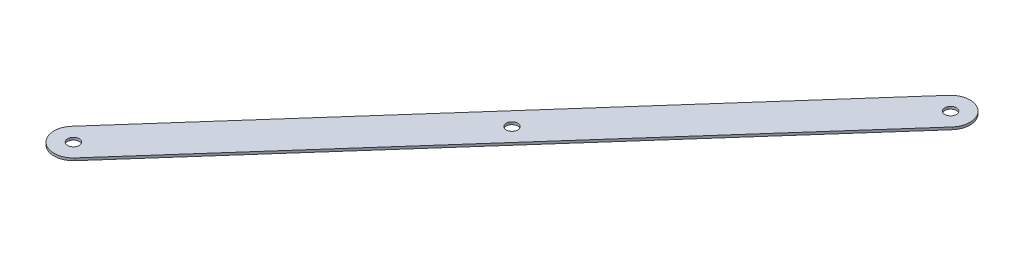
ISO-10303-21;
HEADER;
FILE_DESCRIPTION(('STEP AP214'),'2;1');
FILE_NAME('part.step','',(''),(''),'','','');
FILE_SCHEMA(('AUTOMOTIVE_DESIGN { 1 0 10303 214 1 1 1 1 }'));
ENDSEC;
DATA;
#1=APPLICATION_CONTEXT('core data for automotive mechanical design processes');
#2=APPLICATION_PROTOCOL_DEFINITION('international standard','automotive_design',2000,#1);
#3=PRODUCT_CONTEXT('',#1,'mechanical');
#4=PRODUCT('Part','Part','',(#3));
#5=PRODUCT_RELATED_PRODUCT_CATEGORY('part','',(#4));
#6=PRODUCT_DEFINITION_FORMATION('','',#4);
#7=PRODUCT_DEFINITION_CONTEXT('part definition',#1,'design');
#8=PRODUCT_DEFINITION('design','',#6,#7);
#9=PRODUCT_DEFINITION_SHAPE('','',#8);
#10=(LENGTH_UNIT() NAMED_UNIT(*) SI_UNIT(.MILLI.,.METRE.));
#11=(NAMED_UNIT(*) PLANE_ANGLE_UNIT() SI_UNIT($,.RADIAN.));
#12=(NAMED_UNIT(*) SI_UNIT($,.STERADIAN.) SOLID_ANGLE_UNIT());
#13=UNCERTAINTY_MEASURE_WITH_UNIT(LENGTH_MEASURE(1.E-05),#10,'distance_accuracy_value','');
#14=(GEOMETRIC_REPRESENTATION_CONTEXT(3) GLOBAL_UNCERTAINTY_ASSIGNED_CONTEXT((#13)) GLOBAL_UNIT_ASSIGNED_CONTEXT((#10,
#11,#12)) REPRESENTATION_CONTEXT('',''));
#15=CARTESIAN_POINT('',(0.,0.,0.));
#16=DIRECTION('',(0.,0.,1.));
#17=DIRECTION('',(1.,0.,0.));
#18=AXIS2_PLACEMENT_3D('',#15,#16,#17);
#19=CARTESIAN_POINT('',(0.,1.5875,0.));
#20=DIRECTION('',(0.,1.,0.));
#21=DIRECTION('',(0.,0.,1.));
#22=AXIS2_PLACEMENT_3D('',#19,#20,#21);
#23=PLANE('',#22);
#24=CARTESIAN_POINT('',(269.295638516068,1.5875,-304.369543608133));
#25=DIRECTION('',(0.,1.,0.));
#26=DIRECTION('',(0.,0.,1.));
#27=AXIS2_PLACEMENT_3D('',#24,#25,#26);
#28=CIRCLE('',#27,3.80999999999998);
#29=CARTESIAN_POINT('',(269.295638516068,1.5875,-300.559543608133));
#30=VERTEX_POINT('',#29);
#31=EDGE_CURVE('E115',#30,#30,#28,.T.);
#32=ORIENTED_EDGE('',*,*,#31,.F.);
#33=EDGE_LOOP('',(#32));
#34=FACE_BOUND('',#33,.T.);
#35=CARTESIAN_POINT('',(0.,1.5875,0.));
#36=DIRECTION('',(0.,1.,0.));
#37=DIRECTION('',(0.,0.,1.));
#38=AXIS2_PLACEMENT_3D('',#35,#36,#37);
#39=CIRCLE('',#38,12.7);
#40=CARTESIAN_POINT('',(-9.51154823775415,1.5875,-8.41548870362711));
#41=VERTEX_POINT('',#40);
#42=CARTESIAN_POINT('',(9.51154823775415,1.5875,8.41548870362712));
#43=VERTEX_POINT('',#42);
#44=EDGE_CURVE('E85',#41,#43,#39,.T.);
#45=ORIENTED_EDGE('',*,*,#44,.T.);
#46=DIRECTION('',(0.662636905797411,0.,-0.748940806122375));
#47=VECTOR('',#46,1.);
#48=CARTESIAN_POINT('',(9.51154823775415,1.5875,8.41548870362712));
#49=LINE('',#48,#47);
#50=CARTESIAN_POINT('',(278.807186753822,1.5875,-295.954054904506));
#51=VERTEX_POINT('',#50);
#52=EDGE_CURVE('E80',#43,#51,#49,.T.);
#53=ORIENTED_EDGE('',*,*,#52,.T.);
#54=CARTESIAN_POINT('',(269.295638516068,1.5875,-304.369543608133));
#55=DIRECTION('',(0.,1.,0.));
#56=DIRECTION('',(0.,0.,1.));
#57=AXIS2_PLACEMENT_3D('',#54,#55,#56);
#58=CIRCLE('',#57,12.7);
#59=CARTESIAN_POINT('',(259.784090278314,1.5875,-312.78503231176));
#60=VERTEX_POINT('',#59);
#61=EDGE_CURVE('E83',#51,#60,#58,.T.);
#62=ORIENTED_EDGE('',*,*,#61,.T.);
#63=DIRECTION('',(-0.662636905797411,0.,0.748940806122375));
#64=VECTOR('',#63,1.);
#65=CARTESIAN_POINT('',(-9.51154823775415,1.5875,-8.41548870362711));
#66=LINE('',#65,#64);
#67=EDGE_CURVE('E50',#60,#41,#66,.T.);
#68=ORIENTED_EDGE('',*,*,#67,.T.);
#69=EDGE_LOOP('',(#45,#53,#62,#68));
#70=FACE_BOUND('',#69,.T.);
#71=CARTESIAN_POINT('',(134.647819258034,1.5875,-152.184771804067));
#72=DIRECTION('',(0.,1.,0.));
#73=DIRECTION('',(0.,0.,1.));
#74=AXIS2_PLACEMENT_3D('',#71,#72,#73);
#75=CIRCLE('',#74,3.81000000000002);
#76=CARTESIAN_POINT('',(134.647819258034,1.5875,-148.374771804067));
#77=VERTEX_POINT('',#76);
#78=EDGE_CURVE('E100',#77,#77,#75,.T.);
#79=ORIENTED_EDGE('',*,*,#78,.F.);
#80=EDGE_LOOP('',(#79));
#81=FACE_BOUND('',#80,.T.);
#82=CARTESIAN_POINT('',(0.,1.5875,0.));
#83=DIRECTION('',(0.,1.,0.));
#84=DIRECTION('',(0.,0.,1.));
#85=AXIS2_PLACEMENT_3D('',#82,#83,#84);
#86=CIRCLE('',#85,3.81);
#87=CARTESIAN_POINT('',(0.,1.5875,3.81));
#88=VERTEX_POINT('',#87);
#89=EDGE_CURVE('E121',#88,#88,#86,.T.);
#90=ORIENTED_EDGE('',*,*,#89,.F.);
#91=EDGE_LOOP('',(#90));
#92=FACE_BOUND('',#91,.T.);
#93=ADVANCED_FACE('F33',(#34,#70,#81,#92),#23,.T.);
#94=CARTESIAN_POINT('',(0.,0.,0.));
#95=DIRECTION('',(0.,1.,0.));
#96=DIRECTION('',(0.,0.,1.));
#97=AXIS2_PLACEMENT_3D('',#94,#95,#96);
#98=PLANE('',#97);
#99=CARTESIAN_POINT('',(0.,0.,0.));
#100=DIRECTION('',(0.,1.,0.));
#101=DIRECTION('',(0.,0.,1.));
#102=AXIS2_PLACEMENT_3D('',#99,#100,#101);
#103=CIRCLE('',#102,12.7);
#104=CARTESIAN_POINT('',(-9.51154823775415,0.,-8.41548870362711));
#105=VERTEX_POINT('',#104);
#106=CARTESIAN_POINT('',(9.51154823775415,0.,8.41548870362712));
#107=VERTEX_POINT('',#106);
#108=EDGE_CURVE('E97',#105,#107,#103,.T.);
#109=ORIENTED_EDGE('',*,*,#108,.F.);
#110=DIRECTION('',(-0.662636905797411,0.,0.748940806122375));
#111=VECTOR('',#110,1.);
#112=CARTESIAN_POINT('',(-9.51154823775415,0.,-8.41548870362711));
#113=LINE('',#112,#111);
#114=CARTESIAN_POINT('',(259.784090278314,0.,-312.78503231176));
#115=VERTEX_POINT('',#114);
#116=EDGE_CURVE('E73',#115,#105,#113,.T.);
#117=ORIENTED_EDGE('',*,*,#116,.F.);
#118=CARTESIAN_POINT('',(269.295638516068,0.,-304.369543608133));
#119=DIRECTION('',(0.,1.,0.));
#120=DIRECTION('',(0.,0.,1.));
#121=AXIS2_PLACEMENT_3D('',#118,#119,#120);
#122=CIRCLE('',#121,12.7);
#123=CARTESIAN_POINT('',(278.807186753822,0.,-295.954054904506));
#124=VERTEX_POINT('',#123);
#125=EDGE_CURVE('E67',#124,#115,#122,.T.);
#126=ORIENTED_EDGE('',*,*,#125,.F.);
#127=DIRECTION('',(0.662636905797411,0.,-0.748940806122375));
#128=VECTOR('',#127,1.);
#129=CARTESIAN_POINT('',(9.51154823775415,0.,8.41548870362712));
#130=LINE('',#129,#128);
#131=EDGE_CURVE('E89',#107,#124,#130,.T.);
#132=ORIENTED_EDGE('',*,*,#131,.F.);
#133=EDGE_LOOP('',(#109,#117,#126,#132));
#134=FACE_BOUND('',#133,.T.);
#135=CARTESIAN_POINT('',(134.647819258034,0.,-152.184771804067));
#136=DIRECTION('',(0.,1.,0.));
#137=DIRECTION('',(0.,0.,1.));
#138=AXIS2_PLACEMENT_3D('',#135,#136,#137);
#139=CIRCLE('',#138,3.81000000000002);
#140=CARTESIAN_POINT('',(134.647819258034,0.,-148.374771804067));
#141=VERTEX_POINT('',#140);
#142=EDGE_CURVE('E112',#141,#141,#139,.T.);
#143=ORIENTED_EDGE('',*,*,#142,.T.);
#144=EDGE_LOOP('',(#143));
#145=FACE_BOUND('',#144,.T.);
#146=CARTESIAN_POINT('',(269.295638516068,0.,-304.369543608133));
#147=DIRECTION('',(0.,1.,0.));
#148=DIRECTION('',(0.,0.,1.));
#149=AXIS2_PLACEMENT_3D('',#146,#147,#148);
#150=CIRCLE('',#149,3.80999999999998);
#151=CARTESIAN_POINT('',(269.295638516068,0.,-300.559543608133));
#152=VERTEX_POINT('',#151);
#153=EDGE_CURVE('E118',#152,#152,#150,.T.);
#154=ORIENTED_EDGE('',*,*,#153,.T.);
#155=EDGE_LOOP('',(#154));
#156=FACE_BOUND('',#155,.T.);
#157=CARTESIAN_POINT('',(0.,0.,0.));
#158=DIRECTION('',(0.,1.,0.));
#159=DIRECTION('',(0.,0.,1.));
#160=AXIS2_PLACEMENT_3D('',#157,#158,#159);
#161=CIRCLE('',#160,3.81);
#162=CARTESIAN_POINT('',(0.,0.,3.81));
#163=VERTEX_POINT('',#162);
#164=EDGE_CURVE('E124',#163,#163,#161,.T.);
#165=ORIENTED_EDGE('',*,*,#164,.T.);
#166=EDGE_LOOP('',(#165));
#167=FACE_BOUND('',#166,.T.);
#168=ADVANCED_FACE('F108',(#134,#145,#156,#167),#98,.F.);
#169=CARTESIAN_POINT('',(0.,1.5875,0.));
#170=DIRECTION('',(0.,-1.,0.));
#171=DIRECTION('',(0.,0.,-1.));
#172=AXIS2_PLACEMENT_3D('',#169,#170,#171);
#173=CYLINDRICAL_SURFACE('',#172,12.7);
#174=ORIENTED_EDGE('',*,*,#108,.T.);
#175=DIRECTION('',(0.,-1.,0.));
#176=VECTOR('',#175,1.);
#177=CARTESIAN_POINT('',(9.51154823775415,1.5875,8.41548870362712));
#178=LINE('',#177,#176);
#179=EDGE_CURVE('E11',#43,#107,#178,.T.);
#180=ORIENTED_EDGE('',*,*,#179,.F.);
#181=ORIENTED_EDGE('',*,*,#44,.F.);
#182=DIRECTION('',(0.,-1.,0.));
#183=VECTOR('',#182,1.);
#184=CARTESIAN_POINT('',(-9.51154823775415,1.5875,-8.41548870362711));
#185=LINE('',#184,#183);
#186=EDGE_CURVE('E93',#41,#105,#185,.T.);
#187=ORIENTED_EDGE('',*,*,#186,.T.);
#188=EDGE_LOOP('',(#174,#180,#181,#187));
#189=FACE_BOUND('',#188,.T.);
#190=ADVANCED_FACE('F35',(#189),#173,.T.);
#191=CARTESIAN_POINT('',(9.51154823775415,1.5875,8.41548870362712));
#192=DIRECTION('',(-0.748940806122375,0.,-0.662636905797411));
#193=DIRECTION('',(-0.662636905797411,0.,0.748940806122375));
#194=AXIS2_PLACEMENT_3D('',#191,#192,#193);
#195=PLANE('',#194);
#196=ORIENTED_EDGE('',*,*,#131,.T.);
#197=DIRECTION('',(0.,-1.,0.));
#198=VECTOR('',#197,1.);
#199=CARTESIAN_POINT('',(278.807186753822,1.5875,-295.954054904506));
#200=LINE('',#199,#198);
#201=EDGE_CURVE('E42',#51,#124,#200,.T.);
#202=ORIENTED_EDGE('',*,*,#201,.F.);
#203=ORIENTED_EDGE('',*,*,#52,.F.);
#204=ORIENTED_EDGE('',*,*,#179,.T.);
#205=EDGE_LOOP('',(#196,#202,#203,#204));
#206=FACE_BOUND('',#205,.T.);
#207=ADVANCED_FACE('F88',(#206),#195,.F.);
#208=CARTESIAN_POINT('',(269.295638516068,1.5875,-304.369543608133));
#209=DIRECTION('',(0.,-1.,0.));
#210=DIRECTION('',(0.,0.,-1.));
#211=AXIS2_PLACEMENT_3D('',#208,#209,#210);
#212=CYLINDRICAL_SURFACE('',#211,12.7);
#213=ORIENTED_EDGE('',*,*,#125,.T.);
#214=DIRECTION('',(0.,-1.,0.));
#215=VECTOR('',#214,1.);
#216=CARTESIAN_POINT('',(259.784090278314,1.5875,-312.78503231176));
#217=LINE('',#216,#215);
#218=EDGE_CURVE('E90',#60,#115,#217,.T.);
#219=ORIENTED_EDGE('',*,*,#218,.F.);
#220=ORIENTED_EDGE('',*,*,#61,.F.);
#221=ORIENTED_EDGE('',*,*,#201,.T.);
#222=EDGE_LOOP('',(#213,#219,#220,#221));
#223=FACE_BOUND('',#222,.T.);
#224=ADVANCED_FACE('F91',(#223),#212,.T.);
#225=CARTESIAN_POINT('',(-9.51154823775415,1.5875,-8.41548870362711));
#226=DIRECTION('',(0.748940806122375,0.,0.662636905797411));
#227=DIRECTION('',(0.662636905797411,0.,-0.748940806122375));
#228=AXIS2_PLACEMENT_3D('',#225,#226,#227);
#229=PLANE('',#228);
#230=ORIENTED_EDGE('',*,*,#116,.T.);
#231=ORIENTED_EDGE('',*,*,#186,.F.);
#232=ORIENTED_EDGE('',*,*,#67,.F.);
#233=ORIENTED_EDGE('',*,*,#218,.T.);
#234=EDGE_LOOP('',(#230,#231,#232,#233));
#235=FACE_BOUND('',#234,.T.);
#236=ADVANCED_FACE('F105',(#235),#229,.F.);
#237=CARTESIAN_POINT('',(134.647819258034,1.5875,-152.184771804067));
#238=DIRECTION('',(0.,-1.,0.));
#239=DIRECTION('',(0.,0.,-1.));
#240=AXIS2_PLACEMENT_3D('',#237,#238,#239);
#241=CYLINDRICAL_SURFACE('',#240,3.81000000000002);
#242=ORIENTED_EDGE('',*,*,#78,.T.);
#243=EDGE_LOOP('',(#242));
#244=FACE_BOUND('',#243,.T.);
#245=ORIENTED_EDGE('',*,*,#142,.F.);
#246=EDGE_LOOP('',(#245));
#247=FACE_BOUND('',#246,.T.);
#248=ADVANCED_FACE('F142',(#244,#247),#241,.F.);
#249=CARTESIAN_POINT('',(269.295638516068,1.5875,-304.369543608133));
#250=DIRECTION('',(0.,-1.,0.));
#251=DIRECTION('',(0.,0.,-1.));
#252=AXIS2_PLACEMENT_3D('',#249,#250,#251);
#253=CYLINDRICAL_SURFACE('',#252,3.80999999999998);
#254=ORIENTED_EDGE('',*,*,#31,.T.);
#255=EDGE_LOOP('',(#254));
#256=FACE_BOUND('',#255,.T.);
#257=ORIENTED_EDGE('',*,*,#153,.F.);
#258=EDGE_LOOP('',(#257));
#259=FACE_BOUND('',#258,.T.);
#260=ADVANCED_FACE('F188',(#256,#259),#253,.F.);
#261=CARTESIAN_POINT('',(0.,1.5875,0.));
#262=DIRECTION('',(0.,-1.,0.));
#263=DIRECTION('',(0.,0.,-1.));
#264=AXIS2_PLACEMENT_3D('',#261,#262,#263);
#265=CYLINDRICAL_SURFACE('',#264,3.81);
#266=ORIENTED_EDGE('',*,*,#89,.T.);
#267=EDGE_LOOP('',(#266));
#268=FACE_BOUND('',#267,.T.);
#269=ORIENTED_EDGE('',*,*,#164,.F.);
#270=EDGE_LOOP('',(#269));
#271=FACE_BOUND('',#270,.T.);
#272=ADVANCED_FACE('F130',(#268,#271),#265,.F.);
#273=CLOSED_SHELL('',(#93,#168,#190,#207,#224,#236,#248,#260,#272));
#274=MANIFOLD_SOLID_BREP('B2',#273);
#275=ADVANCED_BREP_SHAPE_REPRESENTATION('',(#18,#274),#14);
#276=SHAPE_DEFINITION_REPRESENTATION(#9,#275);
ENDSEC;
END-ISO-10303-21;
